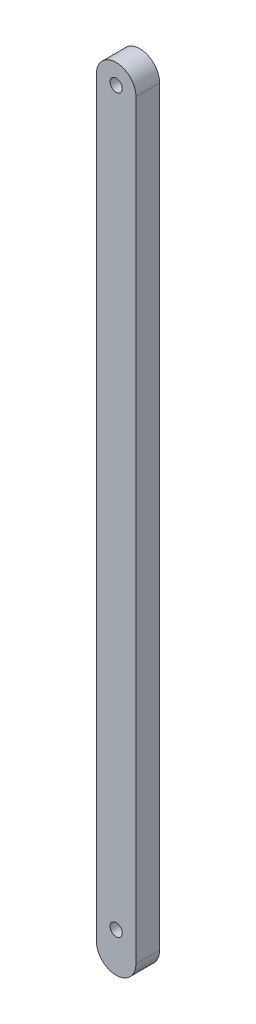
ISO-10303-21;
HEADER;
FILE_DESCRIPTION(('STEP AP214'),'2;1');
FILE_NAME('part.step','',(''),(''),'','','');
FILE_SCHEMA(('AUTOMOTIVE_DESIGN { 1 0 10303 214 1 1 1 1 }'));
ENDSEC;
DATA;
#1=APPLICATION_CONTEXT('core data for automotive mechanical design processes');
#2=APPLICATION_PROTOCOL_DEFINITION('international standard','automotive_design',2000,#1);
#3=PRODUCT_CONTEXT('',#1,'mechanical');
#4=PRODUCT('Part','Part','',(#3));
#5=PRODUCT_RELATED_PRODUCT_CATEGORY('part','',(#4));
#6=PRODUCT_DEFINITION_FORMATION('','',#4);
#7=PRODUCT_DEFINITION_CONTEXT('part definition',#1,'design');
#8=PRODUCT_DEFINITION('design','',#6,#7);
#9=PRODUCT_DEFINITION_SHAPE('','',#8);
#10=(LENGTH_UNIT() NAMED_UNIT(*) SI_UNIT(.MILLI.,.METRE.));
#11=(NAMED_UNIT(*) PLANE_ANGLE_UNIT() SI_UNIT($,.RADIAN.));
#12=(NAMED_UNIT(*) SI_UNIT($,.STERADIAN.) SOLID_ANGLE_UNIT());
#13=UNCERTAINTY_MEASURE_WITH_UNIT(LENGTH_MEASURE(1.E-05),#10,'distance_accuracy_value','');
#14=(GEOMETRIC_REPRESENTATION_CONTEXT(3) GLOBAL_UNCERTAINTY_ASSIGNED_CONTEXT((#13)) GLOBAL_UNIT_ASSIGNED_CONTEXT((#10,
#11,#12)) REPRESENTATION_CONTEXT('',''));
#15=CARTESIAN_POINT('',(0.,0.,0.));
#16=DIRECTION('',(0.,0.,1.));
#17=DIRECTION('',(1.,0.,0.));
#18=AXIS2_PLACEMENT_3D('',#15,#16,#17);
#19=CARTESIAN_POINT('',(-2.,58.,6.));
#20=DIRECTION('',(0.,0.,-1.));
#21=DIRECTION('',(-1.,0.,0.));
#22=AXIS2_PLACEMENT_3D('',#19,#20,#21);
#23=CYLINDRICAL_SURFACE('',#22,5.);
#24=CARTESIAN_POINT('',(-2.,58.,0.));
#25=DIRECTION('',(0.,0.,1.));
#26=DIRECTION('',(1.,0.,0.));
#27=AXIS2_PLACEMENT_3D('',#24,#25,#26);
#28=CIRCLE('',#27,5.);
#29=CARTESIAN_POINT('',(3.,58.,0.));
#30=VERTEX_POINT('',#29);
#31=CARTESIAN_POINT('',(-7.,58.,0.));
#32=VERTEX_POINT('',#31);
#33=EDGE_CURVE('E96',#30,#32,#28,.T.);
#34=ORIENTED_EDGE('',*,*,#33,.T.);
#35=DIRECTION('',(0.,0.,-1.));
#36=VECTOR('',#35,1.);
#37=CARTESIAN_POINT('',(-7.,58.,6.));
#38=LINE('',#37,#36);
#39=CARTESIAN_POINT('',(-7.,58.,6.));
#40=VERTEX_POINT('',#39);
#41=EDGE_CURVE('E11',#40,#32,#38,.T.);
#42=ORIENTED_EDGE('',*,*,#41,.F.);
#43=CARTESIAN_POINT('',(-2.,58.,6.));
#44=DIRECTION('',(0.,0.,1.));
#45=DIRECTION('',(1.,0.,0.));
#46=AXIS2_PLACEMENT_3D('',#43,#44,#45);
#47=CIRCLE('',#46,5.);
#48=CARTESIAN_POINT('',(3.,58.,6.));
#49=VERTEX_POINT('',#48);
#50=EDGE_CURVE('E84',#49,#40,#47,.T.);
#51=ORIENTED_EDGE('',*,*,#50,.F.);
#52=DIRECTION('',(0.,0.,-1.));
#53=VECTOR('',#52,1.);
#54=CARTESIAN_POINT('',(3.,58.,6.));
#55=LINE('',#54,#53);
#56=EDGE_CURVE('E92',#49,#30,#55,.T.);
#57=ORIENTED_EDGE('',*,*,#56,.T.);
#58=EDGE_LOOP('',(#34,#42,#51,#57));
#59=FACE_BOUND('',#58,.T.);
#60=ADVANCED_FACE('F33',(#59),#23,.T.);
#61=CARTESIAN_POINT('',(-7.,-132.,6.));
#62=DIRECTION('',(1.,0.,0.));
#63=DIRECTION('',(0.,1.,0.));
#64=AXIS2_PLACEMENT_3D('',#61,#62,#63);
#65=PLANE('',#64);
#66=DIRECTION('',(0.,-1.,0.));
#67=VECTOR('',#66,1.);
#68=CARTESIAN_POINT('',(-7.,-132.,0.));
#69=LINE('',#68,#67);
#70=CARTESIAN_POINT('',(-7.,-132.,0.));
#71=VERTEX_POINT('',#70);
#72=EDGE_CURVE('E88',#32,#71,#69,.T.);
#73=ORIENTED_EDGE('',*,*,#72,.T.);
#74=DIRECTION('',(0.,0.,-1.));
#75=VECTOR('',#74,1.);
#76=CARTESIAN_POINT('',(-7.,-132.,6.));
#77=LINE('',#76,#75);
#78=CARTESIAN_POINT('',(-7.,-132.,6.));
#79=VERTEX_POINT('',#78);
#80=EDGE_CURVE('E41',#79,#71,#77,.T.);
#81=ORIENTED_EDGE('',*,*,#80,.F.);
#82=DIRECTION('',(0.,-1.,0.));
#83=VECTOR('',#82,1.);
#84=CARTESIAN_POINT('',(-7.,-132.,6.));
#85=LINE('',#84,#83);
#86=EDGE_CURVE('E79',#40,#79,#85,.T.);
#87=ORIENTED_EDGE('',*,*,#86,.F.);
#88=ORIENTED_EDGE('',*,*,#41,.T.);
#89=EDGE_LOOP('',(#73,#81,#87,#88));
#90=FACE_BOUND('',#89,.T.);
#91=ADVANCED_FACE('F87',(#90),#65,.F.);
#92=CARTESIAN_POINT('',(-2.,-132.,6.));
#93=DIRECTION('',(0.,0.,-1.));
#94=DIRECTION('',(-1.,0.,0.));
#95=AXIS2_PLACEMENT_3D('',#92,#93,#94);
#96=CYLINDRICAL_SURFACE('',#95,5.);
#97=CARTESIAN_POINT('',(-2.,-132.,0.));
#98=DIRECTION('',(0.,0.,1.));
#99=DIRECTION('',(1.,0.,0.));
#100=AXIS2_PLACEMENT_3D('',#97,#98,#99);
#101=CIRCLE('',#100,5.);
#102=CARTESIAN_POINT('',(3.,-132.,0.));
#103=VERTEX_POINT('',#102);
#104=EDGE_CURVE('E66',#71,#103,#101,.T.);
#105=ORIENTED_EDGE('',*,*,#104,.T.);
#106=DIRECTION('',(0.,0.,-1.));
#107=VECTOR('',#106,1.);
#108=CARTESIAN_POINT('',(3.,-132.,6.));
#109=LINE('',#108,#107);
#110=CARTESIAN_POINT('',(3.,-132.,6.));
#111=VERTEX_POINT('',#110);
#112=EDGE_CURVE('E89',#111,#103,#109,.T.);
#113=ORIENTED_EDGE('',*,*,#112,.F.);
#114=CARTESIAN_POINT('',(-2.,-132.,6.));
#115=DIRECTION('',(0.,0.,1.));
#116=DIRECTION('',(1.,0.,0.));
#117=AXIS2_PLACEMENT_3D('',#114,#115,#116);
#118=CIRCLE('',#117,5.);
#119=EDGE_CURVE('E82',#79,#111,#118,.T.);
#120=ORIENTED_EDGE('',*,*,#119,.F.);
#121=ORIENTED_EDGE('',*,*,#80,.T.);
#122=EDGE_LOOP('',(#105,#113,#120,#121));
#123=FACE_BOUND('',#122,.T.);
#124=ADVANCED_FACE('F90',(#123),#96,.T.);
#125=CARTESIAN_POINT('',(3.,-132.,6.));
#126=DIRECTION('',(-1.,0.,0.));
#127=DIRECTION('',(0.,-1.,0.));
#128=AXIS2_PLACEMENT_3D('',#125,#126,#127);
#129=PLANE('',#128);
#130=DIRECTION('',(0.,1.,0.));
#131=VECTOR('',#130,1.);
#132=CARTESIAN_POINT('',(3.,-132.,0.));
#133=LINE('',#132,#131);
#134=EDGE_CURVE('E72',#103,#30,#133,.T.);
#135=ORIENTED_EDGE('',*,*,#134,.T.);
#136=ORIENTED_EDGE('',*,*,#56,.F.);
#137=DIRECTION('',(0.,1.,0.));
#138=VECTOR('',#137,1.);
#139=CARTESIAN_POINT('',(3.,-132.,6.));
#140=LINE('',#139,#138);
#141=EDGE_CURVE('E49',#111,#49,#140,.T.);
#142=ORIENTED_EDGE('',*,*,#141,.F.);
#143=ORIENTED_EDGE('',*,*,#112,.T.);
#144=EDGE_LOOP('',(#135,#136,#142,#143));
#145=FACE_BOUND('',#144,.T.);
#146=ADVANCED_FACE('F104',(#145),#129,.F.);
#147=CARTESIAN_POINT('',(-2.,58.,6.));
#148=DIRECTION('',(0.,0.,1.));
#149=DIRECTION('',(1.,0.,0.));
#150=AXIS2_PLACEMENT_3D('',#147,#148,#149);
#151=PLANE('',#150);
#152=CARTESIAN_POINT('',(-2.,-127.,6.));
#153=DIRECTION('',(0.,0.,1.));
#154=DIRECTION('',(1.,0.,0.));
#155=AXIS2_PLACEMENT_3D('',#152,#153,#154);
#156=CIRCLE('',#155,1.55);
#157=CARTESIAN_POINT('',(-0.449999999999999,-127.,6.));
#158=VERTEX_POINT('',#157);
#159=EDGE_CURVE('E99',#158,#158,#156,.F.);
#160=ORIENTED_EDGE('',*,*,#159,.T.);
#161=EDGE_LOOP('',(#160));
#162=FACE_BOUND('',#161,.T.);
#163=CARTESIAN_POINT('',(-2.,58.,6.));
#164=DIRECTION('',(0.,0.,1.));
#165=DIRECTION('',(1.,0.,0.));
#166=AXIS2_PLACEMENT_3D('',#163,#164,#165);
#167=CIRCLE('',#166,1.55);
#168=CARTESIAN_POINT('',(-0.449999999999995,58.,6.));
#169=VERTEX_POINT('',#168);
#170=EDGE_CURVE('E110',#169,#169,#167,.F.);
#171=ORIENTED_EDGE('',*,*,#170,.T.);
#172=EDGE_LOOP('',(#171));
#173=FACE_BOUND('',#172,.T.);
#174=ORIENTED_EDGE('',*,*,#50,.T.);
#175=ORIENTED_EDGE('',*,*,#86,.T.);
#176=ORIENTED_EDGE('',*,*,#119,.T.);
#177=ORIENTED_EDGE('',*,*,#141,.T.);
#178=EDGE_LOOP('',(#174,#175,#176,#177));
#179=FACE_BOUND('',#178,.T.);
#180=ADVANCED_FACE('F80',(#162,#173,#179),#151,.T.);
#181=CARTESIAN_POINT('',(-2.,58.,0.));
#182=DIRECTION('',(0.,0.,1.));
#183=DIRECTION('',(1.,0.,0.));
#184=AXIS2_PLACEMENT_3D('',#181,#182,#183);
#185=PLANE('',#184);
#186=CARTESIAN_POINT('',(-2.,-127.,0.));
#187=DIRECTION('',(0.,0.,-1.));
#188=DIRECTION('',(-1.,0.,0.));
#189=AXIS2_PLACEMENT_3D('',#186,#187,#188);
#190=CIRCLE('',#189,1.55);
#191=CARTESIAN_POINT('',(-3.55,-127.,0.));
#192=VERTEX_POINT('',#191);
#193=EDGE_CURVE('E113',#192,#192,#190,.T.);
#194=ORIENTED_EDGE('',*,*,#193,.F.);
#195=EDGE_LOOP('',(#194));
#196=FACE_BOUND('',#195,.T.);
#197=CARTESIAN_POINT('',(-2.,58.,0.));
#198=DIRECTION('',(0.,0.,-1.));
#199=DIRECTION('',(1.,0.,0.));
#200=AXIS2_PLACEMENT_3D('',#197,#198,#199);
#201=CIRCLE('',#200,1.55);
#202=CARTESIAN_POINT('',(-0.449999999999995,58.,0.));
#203=VERTEX_POINT('',#202);
#204=EDGE_CURVE('E114',#203,#203,#201,.T.);
#205=ORIENTED_EDGE('',*,*,#204,.F.);
#206=EDGE_LOOP('',(#205));
#207=FACE_BOUND('',#206,.T.);
#208=ORIENTED_EDGE('',*,*,#33,.F.);
#209=ORIENTED_EDGE('',*,*,#134,.F.);
#210=ORIENTED_EDGE('',*,*,#104,.F.);
#211=ORIENTED_EDGE('',*,*,#72,.F.);
#212=EDGE_LOOP('',(#208,#209,#210,#211));
#213=FACE_BOUND('',#212,.T.);
#214=ADVANCED_FACE('F107',(#196,#207,#213),#185,.F.);
#215=CARTESIAN_POINT('',(-2.,58.,10.3840620433566));
#216=DIRECTION('',(0.,0.,-1.));
#217=DIRECTION('',(-1.,0.,0.));
#218=AXIS2_PLACEMENT_3D('',#215,#216,#217);
#219=CYLINDRICAL_SURFACE('',#218,1.55);
#220=ORIENTED_EDGE('',*,*,#204,.T.);
#221=EDGE_LOOP('',(#220));
#222=FACE_BOUND('',#221,.T.);
#223=ORIENTED_EDGE('',*,*,#170,.F.);
#224=EDGE_LOOP('',(#223));
#225=FACE_BOUND('',#224,.T.);
#226=ADVANCED_FACE('F127',(#222,#225),#219,.F.);
#227=CARTESIAN_POINT('',(-2.,-127.,10.3840620433566));
#228=DIRECTION('',(0.,0.,-1.));
#229=DIRECTION('',(-1.,0.,0.));
#230=AXIS2_PLACEMENT_3D('',#227,#228,#229);
#231=CYLINDRICAL_SURFACE('',#230,1.55);
#232=ORIENTED_EDGE('',*,*,#193,.T.);
#233=EDGE_LOOP('',(#232));
#234=FACE_BOUND('',#233,.T.);
#235=ORIENTED_EDGE('',*,*,#159,.F.);
#236=EDGE_LOOP('',(#235));
#237=FACE_BOUND('',#236,.T.);
#238=ADVANCED_FACE('F122',(#234,#237),#231,.F.);
#239=CLOSED_SHELL('',(#60,#91,#124,#146,#180,#214,#226,#238));
#240=MANIFOLD_SOLID_BREP('B2',#239);
#241=ADVANCED_BREP_SHAPE_REPRESENTATION('',(#18,#240),#14);
#242=SHAPE_DEFINITION_REPRESENTATION(#9,#241);
ENDSEC;
END-ISO-10303-21;
